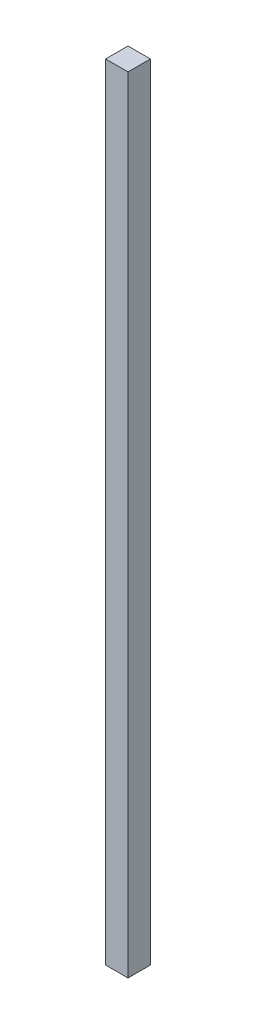
ISO-10303-21;
HEADER;
FILE_DESCRIPTION(('STEP AP214'),'2;1');
FILE_NAME('part.step','',(''),(''),'','','');
FILE_SCHEMA(('AUTOMOTIVE_DESIGN { 1 0 10303 214 1 1 1 1 }'));
ENDSEC;
DATA;
#1=APPLICATION_CONTEXT('core data for automotive mechanical design processes');
#2=APPLICATION_PROTOCOL_DEFINITION('international standard','automotive_design',2000,#1);
#3=PRODUCT_CONTEXT('',#1,'mechanical');
#4=PRODUCT('Part','Part','',(#3));
#5=PRODUCT_RELATED_PRODUCT_CATEGORY('part','',(#4));
#6=PRODUCT_DEFINITION_FORMATION('','',#4);
#7=PRODUCT_DEFINITION_CONTEXT('part definition',#1,'design');
#8=PRODUCT_DEFINITION('design','',#6,#7);
#9=PRODUCT_DEFINITION_SHAPE('','',#8);
#10=(LENGTH_UNIT() NAMED_UNIT(*) SI_UNIT(.MILLI.,.METRE.));
#11=(NAMED_UNIT(*) PLANE_ANGLE_UNIT() SI_UNIT($,.RADIAN.));
#12=(NAMED_UNIT(*) SI_UNIT($,.STERADIAN.) SOLID_ANGLE_UNIT());
#13=UNCERTAINTY_MEASURE_WITH_UNIT(LENGTH_MEASURE(1.E-05),#10,'distance_accuracy_value','');
#14=(GEOMETRIC_REPRESENTATION_CONTEXT(3) GLOBAL_UNCERTAINTY_ASSIGNED_CONTEXT((#13)) GLOBAL_UNIT_ASSIGNED_CONTEXT((#10,
#11,#12)) REPRESENTATION_CONTEXT('',''));
#15=CARTESIAN_POINT('',(0.,0.,0.));
#16=DIRECTION('',(0.,0.,1.));
#17=DIRECTION('',(1.,0.,0.));
#18=AXIS2_PLACEMENT_3D('',#15,#16,#17);
#19=CARTESIAN_POINT('',(10.,700.,-10.));
#20=DIRECTION('',(-1.,0.,0.));
#21=DIRECTION('',(0.,0.,1.));
#22=AXIS2_PLACEMENT_3D('',#19,#20,#21);
#23=PLANE('',#22);
#24=DIRECTION('',(0.,0.,-1.));
#25=VECTOR('',#24,1.);
#26=CARTESIAN_POINT('',(10.,0.,-10.));
#27=LINE('',#26,#25);
#28=CARTESIAN_POINT('',(10.,0.,10.));
#29=VERTEX_POINT('',#28);
#30=CARTESIAN_POINT('',(10.,0.,-10.));
#31=VERTEX_POINT('',#30);
#32=EDGE_CURVE('E96',#29,#31,#27,.T.);
#33=ORIENTED_EDGE('',*,*,#32,.T.);
#34=DIRECTION('',(0.,-1.,0.));
#35=VECTOR('',#34,1.);
#36=CARTESIAN_POINT('',(10.,700.,-10.));
#37=LINE('',#36,#35);
#38=CARTESIAN_POINT('',(10.,700.,-10.));
#39=VERTEX_POINT('',#38);
#40=EDGE_CURVE('E11',#39,#31,#37,.T.);
#41=ORIENTED_EDGE('',*,*,#40,.F.);
#42=DIRECTION('',(0.,0.,-1.));
#43=VECTOR('',#42,1.);
#44=CARTESIAN_POINT('',(10.,700.,-10.));
#45=LINE('',#44,#43);
#46=CARTESIAN_POINT('',(10.,700.,10.));
#47=VERTEX_POINT('',#46);
#48=EDGE_CURVE('E84',#47,#39,#45,.T.);
#49=ORIENTED_EDGE('',*,*,#48,.F.);
#50=DIRECTION('',(0.,-1.,0.));
#51=VECTOR('',#50,1.);
#52=CARTESIAN_POINT('',(10.,700.,10.));
#53=LINE('',#52,#51);
#54=EDGE_CURVE('E92',#47,#29,#53,.T.);
#55=ORIENTED_EDGE('',*,*,#54,.T.);
#56=EDGE_LOOP('',(#33,#41,#49,#55));
#57=FACE_BOUND('',#56,.T.);
#58=ADVANCED_FACE('F33',(#57),#23,.F.);
#59=CARTESIAN_POINT('',(-10.,700.,-10.));
#60=DIRECTION('',(0.,0.,1.));
#61=DIRECTION('',(1.,0.,0.));
#62=AXIS2_PLACEMENT_3D('',#59,#60,#61);
#63=PLANE('',#62);
#64=DIRECTION('',(-1.,0.,0.));
#65=VECTOR('',#64,1.);
#66=CARTESIAN_POINT('',(-10.,0.,-10.));
#67=LINE('',#66,#65);
#68=CARTESIAN_POINT('',(-10.,0.,-10.));
#69=VERTEX_POINT('',#68);
#70=EDGE_CURVE('E88',#31,#69,#67,.T.);
#71=ORIENTED_EDGE('',*,*,#70,.T.);
#72=DIRECTION('',(0.,-1.,0.));
#73=VECTOR('',#72,1.);
#74=CARTESIAN_POINT('',(-10.,700.,-10.));
#75=LINE('',#74,#73);
#76=CARTESIAN_POINT('',(-10.,700.,-10.));
#77=VERTEX_POINT('',#76);
#78=EDGE_CURVE('E41',#77,#69,#75,.T.);
#79=ORIENTED_EDGE('',*,*,#78,.F.);
#80=DIRECTION('',(-1.,0.,0.));
#81=VECTOR('',#80,1.);
#82=CARTESIAN_POINT('',(-10.,700.,-10.));
#83=LINE('',#82,#81);
#84=EDGE_CURVE('E79',#39,#77,#83,.T.);
#85=ORIENTED_EDGE('',*,*,#84,.F.);
#86=ORIENTED_EDGE('',*,*,#40,.T.);
#87=EDGE_LOOP('',(#71,#79,#85,#86));
#88=FACE_BOUND('',#87,.T.);
#89=ADVANCED_FACE('F87',(#88),#63,.F.);
#90=CARTESIAN_POINT('',(-10.,700.,-10.));
#91=DIRECTION('',(1.,0.,0.));
#92=DIRECTION('',(0.,0.,-1.));
#93=AXIS2_PLACEMENT_3D('',#90,#91,#92);
#94=PLANE('',#93);
#95=DIRECTION('',(0.,0.,1.));
#96=VECTOR('',#95,1.);
#97=CARTESIAN_POINT('',(-10.,0.,-10.));
#98=LINE('',#97,#96);
#99=CARTESIAN_POINT('',(-10.,0.,10.));
#100=VERTEX_POINT('',#99);
#101=EDGE_CURVE('E66',#69,#100,#98,.T.);
#102=ORIENTED_EDGE('',*,*,#101,.T.);
#103=DIRECTION('',(0.,-1.,0.));
#104=VECTOR('',#103,1.);
#105=CARTESIAN_POINT('',(-10.,700.,10.));
#106=LINE('',#105,#104);
#107=CARTESIAN_POINT('',(-10.,700.,10.));
#108=VERTEX_POINT('',#107);
#109=EDGE_CURVE('E89',#108,#100,#106,.T.);
#110=ORIENTED_EDGE('',*,*,#109,.F.);
#111=DIRECTION('',(0.,0.,1.));
#112=VECTOR('',#111,1.);
#113=CARTESIAN_POINT('',(-10.,700.,-10.));
#114=LINE('',#113,#112);
#115=EDGE_CURVE('E82',#77,#108,#114,.T.);
#116=ORIENTED_EDGE('',*,*,#115,.F.);
#117=ORIENTED_EDGE('',*,*,#78,.T.);
#118=EDGE_LOOP('',(#102,#110,#116,#117));
#119=FACE_BOUND('',#118,.T.);
#120=ADVANCED_FACE('F90',(#119),#94,.F.);
#121=CARTESIAN_POINT('',(-10.,700.,10.));
#122=DIRECTION('',(0.,0.,-1.));
#123=DIRECTION('',(-1.,0.,0.));
#124=AXIS2_PLACEMENT_3D('',#121,#122,#123);
#125=PLANE('',#124);
#126=DIRECTION('',(1.,0.,0.));
#127=VECTOR('',#126,1.);
#128=CARTESIAN_POINT('',(-10.,0.,10.));
#129=LINE('',#128,#127);
#130=EDGE_CURVE('E72',#100,#29,#129,.T.);
#131=ORIENTED_EDGE('',*,*,#130,.T.);
#132=ORIENTED_EDGE('',*,*,#54,.F.);
#133=DIRECTION('',(1.,0.,0.));
#134=VECTOR('',#133,1.);
#135=CARTESIAN_POINT('',(-10.,700.,10.));
#136=LINE('',#135,#134);
#137=EDGE_CURVE('E49',#108,#47,#136,.T.);
#138=ORIENTED_EDGE('',*,*,#137,.F.);
#139=ORIENTED_EDGE('',*,*,#109,.T.);
#140=EDGE_LOOP('',(#131,#132,#138,#139));
#141=FACE_BOUND('',#140,.T.);
#142=ADVANCED_FACE('F103',(#141),#125,.F.);
#143=CARTESIAN_POINT('',(0.,700.,0.));
#144=DIRECTION('',(0.,1.,0.));
#145=DIRECTION('',(0.,0.,1.));
#146=AXIS2_PLACEMENT_3D('',#143,#144,#145);
#147=PLANE('',#146);
#148=ORIENTED_EDGE('',*,*,#48,.T.);
#149=ORIENTED_EDGE('',*,*,#84,.T.);
#150=ORIENTED_EDGE('',*,*,#115,.T.);
#151=ORIENTED_EDGE('',*,*,#137,.T.);
#152=EDGE_LOOP('',(#148,#149,#150,#151));
#153=FACE_BOUND('',#152,.T.);
#154=ADVANCED_FACE('F80',(#153),#147,.T.);
#155=CARTESIAN_POINT('',(0.,0.,0.));
#156=DIRECTION('',(0.,1.,0.));
#157=DIRECTION('',(0.,0.,1.));
#158=AXIS2_PLACEMENT_3D('',#155,#156,#157);
#159=PLANE('',#158);
#160=ORIENTED_EDGE('',*,*,#32,.F.);
#161=ORIENTED_EDGE('',*,*,#130,.F.);
#162=ORIENTED_EDGE('',*,*,#101,.F.);
#163=ORIENTED_EDGE('',*,*,#70,.F.);
#164=EDGE_LOOP('',(#160,#161,#162,#163));
#165=FACE_BOUND('',#164,.T.);
#166=ADVANCED_FACE('F106',(#165),#159,.F.);
#167=CLOSED_SHELL('',(#58,#89,#120,#142,#154,#166));
#168=MANIFOLD_SOLID_BREP('B2',#167);
#169=ADVANCED_BREP_SHAPE_REPRESENTATION('',(#18,#168),#14);
#170=SHAPE_DEFINITION_REPRESENTATION(#9,#169);
ENDSEC;
END-ISO-10303-21;
